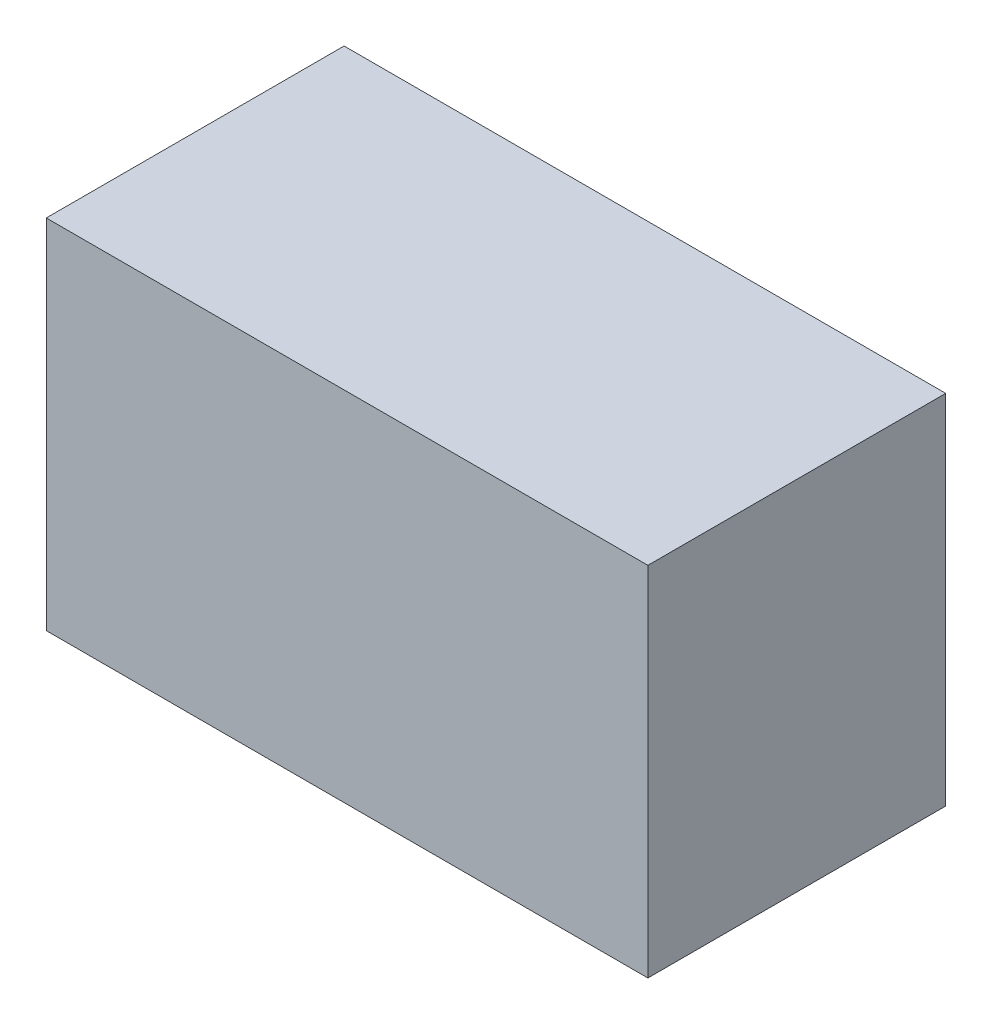
ISO-10303-21;
HEADER;
FILE_DESCRIPTION(('STEP AP214'),'2;1');
FILE_NAME('part.step','',(''),(''),'','','');
FILE_SCHEMA(('AUTOMOTIVE_DESIGN { 1 0 10303 214 1 1 1 1 }'));
ENDSEC;
DATA;
#1=APPLICATION_CONTEXT('core data for automotive mechanical design processes');
#2=APPLICATION_PROTOCOL_DEFINITION('international standard','automotive_design',2000,#1);
#3=PRODUCT_CONTEXT('',#1,'mechanical');
#4=PRODUCT('Part','Part','',(#3));
#5=PRODUCT_RELATED_PRODUCT_CATEGORY('part','',(#4));
#6=PRODUCT_DEFINITION_FORMATION('','',#4);
#7=PRODUCT_DEFINITION_CONTEXT('part definition',#1,'design');
#8=PRODUCT_DEFINITION('design','',#6,#7);
#9=PRODUCT_DEFINITION_SHAPE('','',#8);
#10=(LENGTH_UNIT() NAMED_UNIT(*) SI_UNIT(.MILLI.,.METRE.));
#11=(NAMED_UNIT(*) PLANE_ANGLE_UNIT() SI_UNIT($,.RADIAN.));
#12=(NAMED_UNIT(*) SI_UNIT($,.STERADIAN.) SOLID_ANGLE_UNIT());
#13=UNCERTAINTY_MEASURE_WITH_UNIT(LENGTH_MEASURE(1.E-05),#10,'distance_accuracy_value','');
#14=(GEOMETRIC_REPRESENTATION_CONTEXT(3) GLOBAL_UNCERTAINTY_ASSIGNED_CONTEXT((#13)) GLOBAL_UNIT_ASSIGNED_CONTEXT((#10,
#11,#12)) REPRESENTATION_CONTEXT('',''));
#15=CARTESIAN_POINT('',(0.,0.,0.));
#16=DIRECTION('',(0.,0.,1.));
#17=DIRECTION('',(1.,0.,0.));
#18=AXIS2_PLACEMENT_3D('',#15,#16,#17);
#19=CARTESIAN_POINT('',(10.1,12.,-5.));
#20=DIRECTION('',(-1.,0.,0.));
#21=DIRECTION('',(0.,0.,1.));
#22=AXIS2_PLACEMENT_3D('',#19,#20,#21);
#23=PLANE('',#22);
#24=DIRECTION('',(0.,0.,-1.));
#25=VECTOR('',#24,1.);
#26=CARTESIAN_POINT('',(10.1,0.,-5.));
#27=LINE('',#26,#25);
#28=CARTESIAN_POINT('',(10.1,0.,5.));
#29=VERTEX_POINT('',#28);
#30=CARTESIAN_POINT('',(10.1,0.,-5.));
#31=VERTEX_POINT('',#30);
#32=EDGE_CURVE('E96',#29,#31,#27,.T.);
#33=ORIENTED_EDGE('',*,*,#32,.T.);
#34=DIRECTION('',(0.,-1.,0.));
#35=VECTOR('',#34,1.);
#36=CARTESIAN_POINT('',(10.1,12.,-5.));
#37=LINE('',#36,#35);
#38=CARTESIAN_POINT('',(10.1,12.,-5.));
#39=VERTEX_POINT('',#38);
#40=EDGE_CURVE('E11',#39,#31,#37,.T.);
#41=ORIENTED_EDGE('',*,*,#40,.F.);
#42=DIRECTION('',(0.,0.,-1.));
#43=VECTOR('',#42,1.);
#44=CARTESIAN_POINT('',(10.1,12.,-5.));
#45=LINE('',#44,#43);
#46=CARTESIAN_POINT('',(10.1,12.,5.));
#47=VERTEX_POINT('',#46);
#48=EDGE_CURVE('E84',#47,#39,#45,.T.);
#49=ORIENTED_EDGE('',*,*,#48,.F.);
#50=DIRECTION('',(0.,-1.,0.));
#51=VECTOR('',#50,1.);
#52=CARTESIAN_POINT('',(10.1,12.,5.));
#53=LINE('',#52,#51);
#54=EDGE_CURVE('E92',#47,#29,#53,.T.);
#55=ORIENTED_EDGE('',*,*,#54,.T.);
#56=EDGE_LOOP('',(#33,#41,#49,#55));
#57=FACE_BOUND('',#56,.T.);
#58=ADVANCED_FACE('F33',(#57),#23,.F.);
#59=CARTESIAN_POINT('',(-10.1,12.,-5.));
#60=DIRECTION('',(0.,0.,1.));
#61=DIRECTION('',(1.,0.,0.));
#62=AXIS2_PLACEMENT_3D('',#59,#60,#61);
#63=PLANE('',#62);
#64=DIRECTION('',(-1.,0.,0.));
#65=VECTOR('',#64,1.);
#66=CARTESIAN_POINT('',(-10.1,0.,-5.));
#67=LINE('',#66,#65);
#68=CARTESIAN_POINT('',(-10.1,0.,-5.));
#69=VERTEX_POINT('',#68);
#70=EDGE_CURVE('E88',#31,#69,#67,.T.);
#71=ORIENTED_EDGE('',*,*,#70,.T.);
#72=DIRECTION('',(0.,-1.,0.));
#73=VECTOR('',#72,1.);
#74=CARTESIAN_POINT('',(-10.1,12.,-5.));
#75=LINE('',#74,#73);
#76=CARTESIAN_POINT('',(-10.1,12.,-5.));
#77=VERTEX_POINT('',#76);
#78=EDGE_CURVE('E41',#77,#69,#75,.T.);
#79=ORIENTED_EDGE('',*,*,#78,.F.);
#80=DIRECTION('',(-1.,0.,0.));
#81=VECTOR('',#80,1.);
#82=CARTESIAN_POINT('',(-10.1,12.,-5.));
#83=LINE('',#82,#81);
#84=EDGE_CURVE('E79',#39,#77,#83,.T.);
#85=ORIENTED_EDGE('',*,*,#84,.F.);
#86=ORIENTED_EDGE('',*,*,#40,.T.);
#87=EDGE_LOOP('',(#71,#79,#85,#86));
#88=FACE_BOUND('',#87,.T.);
#89=ADVANCED_FACE('F87',(#88),#63,.F.);
#90=CARTESIAN_POINT('',(-10.1,12.,-5.));
#91=DIRECTION('',(1.,0.,0.));
#92=DIRECTION('',(0.,0.,-1.));
#93=AXIS2_PLACEMENT_3D('',#90,#91,#92);
#94=PLANE('',#93);
#95=DIRECTION('',(0.,0.,1.));
#96=VECTOR('',#95,1.);
#97=CARTESIAN_POINT('',(-10.1,0.,-5.));
#98=LINE('',#97,#96);
#99=CARTESIAN_POINT('',(-10.1,0.,5.));
#100=VERTEX_POINT('',#99);
#101=EDGE_CURVE('E66',#69,#100,#98,.T.);
#102=ORIENTED_EDGE('',*,*,#101,.T.);
#103=DIRECTION('',(0.,-1.,0.));
#104=VECTOR('',#103,1.);
#105=CARTESIAN_POINT('',(-10.1,12.,5.));
#106=LINE('',#105,#104);
#107=CARTESIAN_POINT('',(-10.1,12.,5.));
#108=VERTEX_POINT('',#107);
#109=EDGE_CURVE('E89',#108,#100,#106,.T.);
#110=ORIENTED_EDGE('',*,*,#109,.F.);
#111=DIRECTION('',(0.,0.,1.));
#112=VECTOR('',#111,1.);
#113=CARTESIAN_POINT('',(-10.1,12.,-5.));
#114=LINE('',#113,#112);
#115=EDGE_CURVE('E82',#77,#108,#114,.T.);
#116=ORIENTED_EDGE('',*,*,#115,.F.);
#117=ORIENTED_EDGE('',*,*,#78,.T.);
#118=EDGE_LOOP('',(#102,#110,#116,#117));
#119=FACE_BOUND('',#118,.T.);
#120=ADVANCED_FACE('F90',(#119),#94,.F.);
#121=CARTESIAN_POINT('',(-10.1,12.,5.));
#122=DIRECTION('',(0.,0.,-1.));
#123=DIRECTION('',(-1.,0.,0.));
#124=AXIS2_PLACEMENT_3D('',#121,#122,#123);
#125=PLANE('',#124);
#126=DIRECTION('',(1.,0.,0.));
#127=VECTOR('',#126,1.);
#128=CARTESIAN_POINT('',(-10.1,0.,5.));
#129=LINE('',#128,#127);
#130=EDGE_CURVE('E72',#100,#29,#129,.T.);
#131=ORIENTED_EDGE('',*,*,#130,.T.);
#132=ORIENTED_EDGE('',*,*,#54,.F.);
#133=DIRECTION('',(1.,0.,0.));
#134=VECTOR('',#133,1.);
#135=CARTESIAN_POINT('',(-10.1,12.,5.));
#136=LINE('',#135,#134);
#137=EDGE_CURVE('E49',#108,#47,#136,.T.);
#138=ORIENTED_EDGE('',*,*,#137,.F.);
#139=ORIENTED_EDGE('',*,*,#109,.T.);
#140=EDGE_LOOP('',(#131,#132,#138,#139));
#141=FACE_BOUND('',#140,.T.);
#142=ADVANCED_FACE('F103',(#141),#125,.F.);
#143=CARTESIAN_POINT('',(0.,12.,0.));
#144=DIRECTION('',(0.,1.,0.));
#145=DIRECTION('',(0.,0.,1.));
#146=AXIS2_PLACEMENT_3D('',#143,#144,#145);
#147=PLANE('',#146);
#148=ORIENTED_EDGE('',*,*,#48,.T.);
#149=ORIENTED_EDGE('',*,*,#84,.T.);
#150=ORIENTED_EDGE('',*,*,#115,.T.);
#151=ORIENTED_EDGE('',*,*,#137,.T.);
#152=EDGE_LOOP('',(#148,#149,#150,#151));
#153=FACE_BOUND('',#152,.T.);
#154=ADVANCED_FACE('F80',(#153),#147,.T.);
#155=CARTESIAN_POINT('',(0.,0.,0.));
#156=DIRECTION('',(0.,1.,0.));
#157=DIRECTION('',(0.,0.,1.));
#158=AXIS2_PLACEMENT_3D('',#155,#156,#157);
#159=PLANE('',#158);
#160=ORIENTED_EDGE('',*,*,#32,.F.);
#161=ORIENTED_EDGE('',*,*,#130,.F.);
#162=ORIENTED_EDGE('',*,*,#101,.F.);
#163=ORIENTED_EDGE('',*,*,#70,.F.);
#164=EDGE_LOOP('',(#160,#161,#162,#163));
#165=FACE_BOUND('',#164,.T.);
#166=ADVANCED_FACE('F106',(#165),#159,.F.);
#167=CLOSED_SHELL('',(#58,#89,#120,#142,#154,#166));
#168=MANIFOLD_SOLID_BREP('B2',#167);
#169=ADVANCED_BREP_SHAPE_REPRESENTATION('',(#18,#168),#14);
#170=SHAPE_DEFINITION_REPRESENTATION(#9,#169);
ENDSEC;
END-ISO-10303-21;
